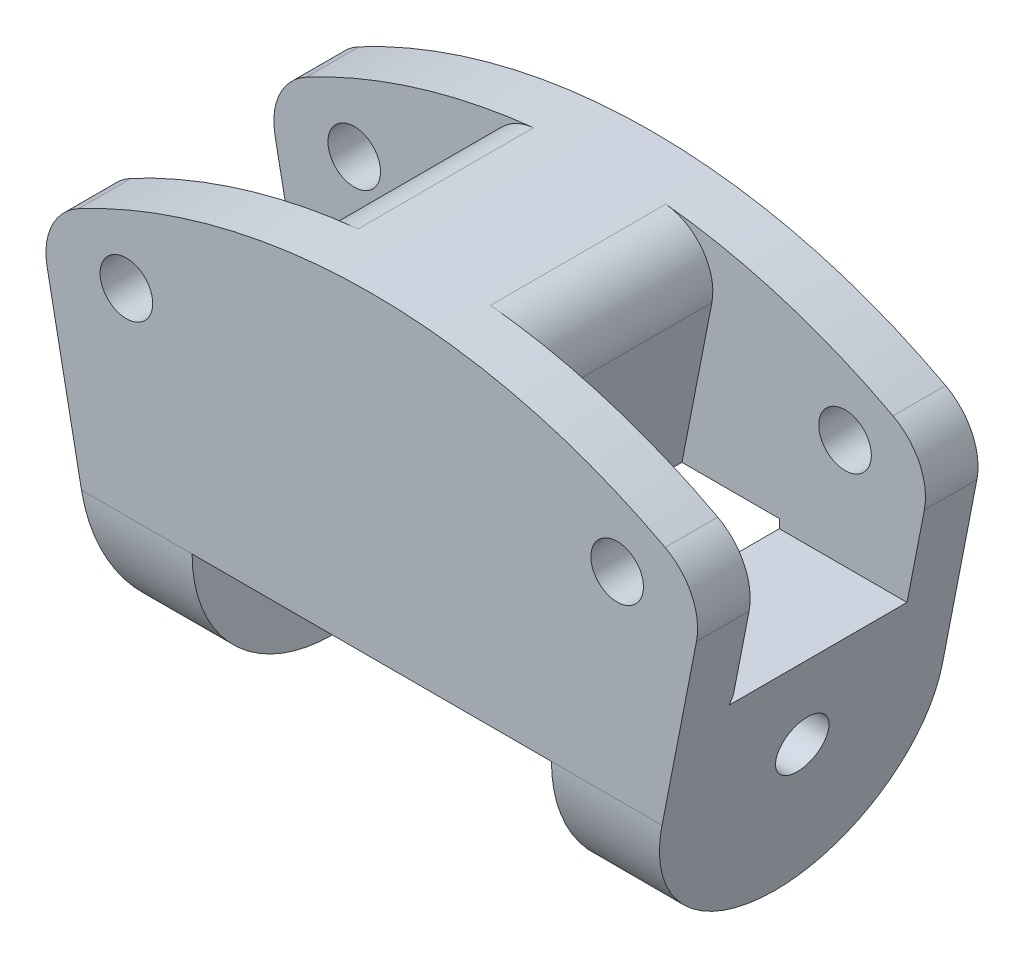
ISO-10303-21;
HEADER;
FILE_DESCRIPTION(('STEP AP214'),'2;1');
FILE_NAME('part.step','',(''),(''),'','','');
FILE_SCHEMA(('AUTOMOTIVE_DESIGN { 1 0 10303 214 1 1 1 1 }'));
ENDSEC;
DATA;
#1=APPLICATION_CONTEXT('core data for automotive mechanical design processes');
#2=APPLICATION_PROTOCOL_DEFINITION('international standard','automotive_design',2000,#1);
#3=PRODUCT_CONTEXT('',#1,'mechanical');
#4=PRODUCT('Part','Part','',(#3));
#5=PRODUCT_RELATED_PRODUCT_CATEGORY('part','',(#4));
#6=PRODUCT_DEFINITION_FORMATION('','',#4);
#7=PRODUCT_DEFINITION_CONTEXT('part definition',#1,'design');
#8=PRODUCT_DEFINITION('design','',#6,#7);
#9=PRODUCT_DEFINITION_SHAPE('','',#8);
#10=(LENGTH_UNIT() NAMED_UNIT(*) SI_UNIT(.MILLI.,.METRE.));
#11=(NAMED_UNIT(*) PLANE_ANGLE_UNIT() SI_UNIT($,.RADIAN.));
#12=(NAMED_UNIT(*) SI_UNIT($,.STERADIAN.) SOLID_ANGLE_UNIT());
#13=UNCERTAINTY_MEASURE_WITH_UNIT(LENGTH_MEASURE(1.E-05),#10,'distance_accuracy_value','');
#14=(GEOMETRIC_REPRESENTATION_CONTEXT(3) GLOBAL_UNCERTAINTY_ASSIGNED_CONTEXT((#13)) GLOBAL_UNIT_ASSIGNED_CONTEXT((#10,
#11,#12)) REPRESENTATION_CONTEXT('',''));
#15=CARTESIAN_POINT('',(0.,0.,0.));
#16=DIRECTION('',(0.,0.,1.));
#17=DIRECTION('',(1.,0.,0.));
#18=AXIS2_PLACEMENT_3D('',#15,#16,#17);
#19=CARTESIAN_POINT('',(0.,-9.5681818181819,5.));
#20=DIRECTION('',(0.,0.,1.));
#21=DIRECTION('',(1.,0.,0.));
#22=AXIS2_PLACEMENT_3D('',#19,#20,#21);
#23=PLANE('',#22);
#24=CARTESIAN_POINT('',(14.,19.25,5.));
#25=DIRECTION('',(0.,0.,1.));
#26=DIRECTION('',(1.,0.,0.));
#27=AXIS2_PLACEMENT_3D('',#24,#25,#26);
#28=CIRCLE('',#27,1.5);
#29=CARTESIAN_POINT('',(15.5,19.25,5.));
#30=VERTEX_POINT('',#29);
#31=EDGE_CURVE('E335',#30,#30,#28,.T.);
#32=ORIENTED_EDGE('',*,*,#31,.T.);
#33=EDGE_LOOP('',(#32));
#34=FACE_BOUND('',#33,.T.);
#35=DIRECTION('',(0.191510359419648,0.981490592025699,0.));
#36=VECTOR('',#35,1.);
#37=CARTESIAN_POINT('',(17.5365853658537,13.,5.));
#38=LINE('',#37,#36);
#39=CARTESIAN_POINT('',(17.6341463414634,13.5,5.));
#40=VERTEX_POINT('',#39);
#41=CARTESIAN_POINT('',(18.5235794301681,18.0583445796115,5.));
#42=VERTEX_POINT('',#41);
#43=EDGE_CURVE('E325',#40,#42,#38,.T.);
#44=ORIENTED_EDGE('',*,*,#43,.F.);
#45=DIRECTION('',(-1.,0.,0.));
#46=VECTOR('',#45,1.);
#47=CARTESIAN_POINT('',(0.,13.5000000000001,5.));
#48=LINE('',#47,#46);
#49=CARTESIAN_POINT('',(4.69670636919273,13.5,5.));
#50=VERTEX_POINT('',#49);
#51=EDGE_CURVE('E437',#40,#50,#48,.T.);
#52=ORIENTED_EDGE('',*,*,#51,.T.);
#53=DIRECTION('',(-0.191510359419649,-0.981490592025699,0.));
#54=VECTOR('',#53,1.);
#55=CARTESIAN_POINT('',(7.,25.3043798578872,5.));
#56=LINE('',#55,#54);
#57=CARTESIAN_POINT('',(6.40234187848178,22.2413819851063,5.));
#58=VERTEX_POINT('',#57);
#59=EDGE_CURVE('E316',#58,#50,#56,.T.);
#60=ORIENTED_EDGE('',*,*,#59,.F.);
#61=CARTESIAN_POINT('',(3.45787010240468,22.8159130633653,5.));
#62=DIRECTION('',(0.,0.,1.));
#63=DIRECTION('',(1.,0.,0.));
#64=AXIS2_PLACEMENT_3D('',#61,#62,#63);
#65=CIRCLE('',#64,3.);
#66=CARTESIAN_POINT('',(3.77638988852988,25.7989559973249,5.));
#67=VERTEX_POINT('',#66);
#68=EDGE_CURVE('E44',#58,#67,#65,.T.);
#69=ORIENTED_EDGE('',*,*,#68,.T.);
#70=CARTESIAN_POINT('',(0.,-9.5681818181819,5.));
#71=DIRECTION('',(0.,0.,1.));
#72=DIRECTION('',(1.,0.,0.));
#73=AXIS2_PLACEMENT_3D('',#70,#71,#72);
#74=CIRCLE('',#73,35.5681818181819);
#75=CARTESIAN_POINT('',(16.7351432249414,21.8170143591872,5.));
#76=VERTEX_POINT('',#75);
#77=EDGE_CURVE('E331',#76,#67,#74,.T.);
#78=ORIENTED_EDGE('',*,*,#77,.F.);
#79=CARTESIAN_POINT('',(15.0883623580782,18.7286308375803,5.));
#80=DIRECTION('',(0.,0.,1.));
#81=DIRECTION('',(1.,0.,0.));
#82=AXIS2_PLACEMENT_3D('',#79,#80,#81);
#83=CIRCLE('',#82,3.5);
#84=EDGE_CURVE('E327',#42,#76,#83,.T.);
#85=ORIENTED_EDGE('',*,*,#84,.F.);
#86=EDGE_LOOP('',(#44,#52,#60,#69,#78,#85));
#87=FACE_BOUND('',#86,.T.);
#88=ADVANCED_FACE('F36',(#34,#87),#23,.F.);
#89=CARTESIAN_POINT('',(-15.0883623580782,18.7286308375803,8.));
#90=DIRECTION('',(0.,0.,-1.));
#91=DIRECTION('',(-1.,0.,0.));
#92=AXIS2_PLACEMENT_3D('',#89,#90,#91);
#93=CYLINDRICAL_SURFACE('',#92,3.5);
#94=CARTESIAN_POINT('',(-15.0883623580782,18.7286308375803,5.));
#95=DIRECTION('',(0.,0.,1.));
#96=DIRECTION('',(-1.,0.,0.));
#97=AXIS2_PLACEMENT_3D('',#94,#95,#96);
#98=CIRCLE('',#97,3.5);
#99=CARTESIAN_POINT('',(-16.7351432249414,21.8170143591872,5.));
#100=VERTEX_POINT('',#99);
#101=CARTESIAN_POINT('',(-18.5235794301681,18.0583445796115,5.));
#102=VERTEX_POINT('',#101);
#103=EDGE_CURVE('E303',#100,#102,#98,.T.);
#104=ORIENTED_EDGE('',*,*,#103,.T.);
#105=DIRECTION('',(0.,0.,-1.));
#106=VECTOR('',#105,1.);
#107=CARTESIAN_POINT('',(-18.5235794301681,18.0583445796115,8.));
#108=LINE('',#107,#106);
#109=CARTESIAN_POINT('',(-18.5235794301681,18.0583445796115,8.));
#110=VERTEX_POINT('',#109);
#111=EDGE_CURVE('E390',#110,#102,#108,.T.);
#112=ORIENTED_EDGE('',*,*,#111,.F.);
#113=CARTESIAN_POINT('',(-15.0883623580782,18.7286308375803,8.));
#114=DIRECTION('',(0.,0.,1.));
#115=DIRECTION('',(1.,0.,0.));
#116=AXIS2_PLACEMENT_3D('',#113,#114,#115);
#117=CIRCLE('',#116,3.5);
#118=CARTESIAN_POINT('',(-16.7351432249414,21.8170143591872,8.));
#119=VERTEX_POINT('',#118);
#120=EDGE_CURVE('E374',#119,#110,#117,.T.);
#121=ORIENTED_EDGE('',*,*,#120,.F.);
#122=DIRECTION('',(0.,0.,-1.));
#123=VECTOR('',#122,1.);
#124=CARTESIAN_POINT('',(-16.7351432249414,21.8170143591872,8.));
#125=LINE('',#124,#123);
#126=EDGE_CURVE('E394',#119,#100,#125,.T.);
#127=ORIENTED_EDGE('',*,*,#126,.T.);
#128=EDGE_LOOP('',(#104,#112,#121,#127));
#129=FACE_BOUND('',#128,.T.);
#130=ADVANCED_FACE('F583',(#129),#93,.T.);
#131=CARTESIAN_POINT('',(-14.,19.25,8.));
#132=DIRECTION('',(0.,0.,-1.));
#133=DIRECTION('',(-1.,0.,0.));
#134=AXIS2_PLACEMENT_3D('',#131,#132,#133);
#135=CYLINDRICAL_SURFACE('',#134,1.5);
#136=CARTESIAN_POINT('',(-14.,19.25,8.));
#137=DIRECTION('',(0.,0.,1.));
#138=DIRECTION('',(1.,0.,0.));
#139=AXIS2_PLACEMENT_3D('',#136,#137,#138);
#140=CIRCLE('',#139,1.5);
#141=CARTESIAN_POINT('',(-12.5,19.25,8.));
#142=VERTEX_POINT('',#141);
#143=EDGE_CURVE('E358',#142,#142,#140,.T.);
#144=ORIENTED_EDGE('',*,*,#143,.T.);
#145=EDGE_LOOP('',(#144));
#146=FACE_BOUND('',#145,.T.);
#147=CARTESIAN_POINT('',(-14.,19.25,5.));
#148=DIRECTION('',(0.,0.,-1.));
#149=DIRECTION('',(-1.,0.,0.));
#150=AXIS2_PLACEMENT_3D('',#147,#148,#149);
#151=CIRCLE('',#150,1.5);
#152=CARTESIAN_POINT('',(-15.5,19.25,5.));
#153=VERTEX_POINT('',#152);
#154=EDGE_CURVE('E312',#153,#153,#151,.T.);
#155=ORIENTED_EDGE('',*,*,#154,.T.);
#156=EDGE_LOOP('',(#155));
#157=FACE_BOUND('',#156,.T.);
#158=ADVANCED_FACE('F588',(#146,#157),#135,.F.);
#159=CARTESIAN_POINT('',(15.,0.,8.));
#160=DIRECTION('',(-0.981490592025699,0.191510359419649,0.));
#161=DIRECTION('',(-0.191510359419649,-0.981490592025699,0.));
#162=AXIS2_PLACEMENT_3D('',#159,#160,#161);
#163=PLANE('',#162);
#164=CARTESIAN_POINT('',(16.5609756097561,8.,0.));
#165=DIRECTION('',(-0.981490592025699,0.191510359419649,0.));
#166=DIRECTION('',(-0.191510359419649,-0.981490592025699,0.));
#167=AXIS2_PLACEMENT_3D('',#164,#165,#166);
#168=ELLIPSE('',#167,1.52828770055162,1.5);
#169=CARTESIAN_POINT('',(16.2682926829268,6.5,0.));
#170=VERTEX_POINT('',#169);
#171=EDGE_CURVE('E278',#170,#170,#168,.T.);
#172=ORIENTED_EDGE('',*,*,#171,.T.);
#173=EDGE_LOOP('',(#172));
#174=FACE_BOUND('',#173,.T.);
#175=DIRECTION('',(0.,0.,1.));
#176=VECTOR('',#175,1.);
#177=CARTESIAN_POINT('',(17.5365853658537,13.,-5.));
#178=LINE('',#177,#176);
#179=CARTESIAN_POINT('',(17.5365853658537,13.,-5.));
#180=VERTEX_POINT('',#179);
#181=CARTESIAN_POINT('',(17.5365853658537,13.,5.13636363636365));
#182=VERTEX_POINT('',#181);
#183=EDGE_CURVE('E324',#180,#182,#178,.T.);
#184=ORIENTED_EDGE('',*,*,#183,.T.);
#185=DIRECTION('',(-0.184997280841847,-0.948111064314465,0.258575744813033));
#186=VECTOR('',#185,1.);
#187=CARTESIAN_POINT('',(17.0306354243086,10.4070065495815,5.84354366829595));
#188=LINE('',#187,#186);
#189=EDGE_CURVE('E445',#182,#40,#188,.F.);
#190=ORIENTED_EDGE('',*,*,#189,.T.);
#191=ORIENTED_EDGE('',*,*,#43,.T.);
#192=DIRECTION('',(0.,0.,-1.));
#193=VECTOR('',#192,1.);
#194=CARTESIAN_POINT('',(18.5235794301681,18.0583445796115,8.));
#195=LINE('',#194,#193);
#196=CARTESIAN_POINT('',(18.5235794301681,18.0583445796115,8.));
#197=VERTEX_POINT('',#196);
#198=EDGE_CURVE('E402',#197,#42,#195,.T.);
#199=ORIENTED_EDGE('',*,*,#198,.F.);
#200=DIRECTION('',(0.191510359419649,0.981490592025699,0.));
#201=VECTOR('',#200,1.);
#202=CARTESIAN_POINT('',(15.,0.,8.));
#203=LINE('',#202,#201);
#204=CARTESIAN_POINT('',(16.5609756097561,8.,8.));
#205=VERTEX_POINT('',#204);
#206=EDGE_CURVE('E367',#205,#197,#203,.T.);
#207=ORIENTED_EDGE('',*,*,#206,.F.);
#208=CARTESIAN_POINT('',(16.5609756097561,8.,0.));
#209=DIRECTION('',(-0.981490592025699,0.191510359419649,0.));
#210=DIRECTION('',(-0.191510359419649,-0.981490592025699,0.));
#211=AXIS2_PLACEMENT_3D('',#208,#209,#210);
#212=ELLIPSE('',#211,8.15086773627529,8.);
#213=CARTESIAN_POINT('',(15.,0.,0.));
#214=VERTEX_POINT('',#213);
#215=EDGE_CURVE('E405',#205,#214,#212,.F.);
#216=ORIENTED_EDGE('',*,*,#215,.T.);
#217=CARTESIAN_POINT('',(16.5609756097561,8.,0.));
#218=DIRECTION('',(-0.981490592025699,0.191510359419649,0.));
#219=DIRECTION('',(0.191510359419649,0.981490592025699,0.));
#220=AXIS2_PLACEMENT_3D('',#217,#218,#219);
#221=ELLIPSE('',#220,8.15086773627529,8.);
#222=CARTESIAN_POINT('',(16.5609756097561,8.,-8.));
#223=VERTEX_POINT('',#222);
#224=EDGE_CURVE('E407',#214,#223,#221,.F.);
#225=ORIENTED_EDGE('',*,*,#224,.T.);
#226=DIRECTION('',(0.191510359419649,0.981490592025699,0.));
#227=VECTOR('',#226,1.);
#228=CARTESIAN_POINT('',(15.,0.,-8.));
#229=LINE('',#228,#227);
#230=CARTESIAN_POINT('',(18.5235794301681,18.0583445796115,-8.));
#231=VERTEX_POINT('',#230);
#232=EDGE_CURVE('E379',#223,#231,#229,.T.);
#233=ORIENTED_EDGE('',*,*,#232,.T.);
#234=CARTESIAN_POINT('',(18.5235794301681,18.0583445796115,-5.));
#235=VERTEX_POINT('',#234);
#236=EDGE_CURVE('E401',#235,#231,#195,.T.);
#237=ORIENTED_EDGE('',*,*,#236,.F.);
#238=DIRECTION('',(0.191510359419648,0.981490592025699,0.));
#239=VECTOR('',#238,1.);
#240=CARTESIAN_POINT('',(17.5365853658537,13.,-5.));
#241=LINE('',#240,#239);
#242=EDGE_CURVE('E315',#180,#235,#241,.T.);
#243=ORIENTED_EDGE('',*,*,#242,.F.);
#244=EDGE_LOOP('',(#184,#190,#191,#199,#207,#216,#225,#233,#237,#243));
#245=FACE_BOUND('',#244,.T.);
#246=ADVANCED_FACE('F540',(#174,#245),#163,.F.);
#247=CARTESIAN_POINT('',(15.0883623580782,18.7286308375803,8.));
#248=DIRECTION('',(0.,0.,-1.));
#249=DIRECTION('',(-1.,0.,0.));
#250=AXIS2_PLACEMENT_3D('',#247,#248,#249);
#251=CYLINDRICAL_SURFACE('',#250,3.5);
#252=CARTESIAN_POINT('',(15.0883623580782,18.7286308375803,-5.));
#253=DIRECTION('',(0.,0.,1.));
#254=DIRECTION('',(1.,0.,0.));
#255=AXIS2_PLACEMENT_3D('',#252,#253,#254);
#256=CIRCLE('',#255,3.5);
#257=CARTESIAN_POINT('',(16.7351432249414,21.8170143591872,-5.));
#258=VERTEX_POINT('',#257);
#259=EDGE_CURVE('E318',#235,#258,#256,.T.);
#260=ORIENTED_EDGE('',*,*,#259,.F.);
#261=ORIENTED_EDGE('',*,*,#236,.T.);
#262=CARTESIAN_POINT('',(15.0883623580782,18.7286308375803,-8.));
#263=DIRECTION('',(0.,0.,1.));
#264=DIRECTION('',(1.,0.,0.));
#265=AXIS2_PLACEMENT_3D('',#262,#263,#264);
#266=CIRCLE('',#265,3.5);
#267=CARTESIAN_POINT('',(16.7351432249414,21.8170143591872,-8.));
#268=VERTEX_POINT('',#267);
#269=EDGE_CURVE('E382',#231,#268,#266,.T.);
#270=ORIENTED_EDGE('',*,*,#269,.T.);
#271=DIRECTION('',(0.,0.,-1.));
#272=VECTOR('',#271,1.);
#273=CARTESIAN_POINT('',(16.7351432249414,21.8170143591872,8.));
#274=LINE('',#273,#272);
#275=EDGE_CURVE('E397',#258,#268,#274,.T.);
#276=ORIENTED_EDGE('',*,*,#275,.F.);
#277=EDGE_LOOP('',(#260,#261,#270,#276));
#278=FACE_BOUND('',#277,.T.);
#279=ADVANCED_FACE('F537',(#278),#251,.T.);
#280=CARTESIAN_POINT('',(0.,-9.5681818181819,8.));
#281=DIRECTION('',(0.,0.,-1.));
#282=DIRECTION('',(-1.,0.,0.));
#283=AXIS2_PLACEMENT_3D('',#280,#281,#282);
#284=CYLINDRICAL_SURFACE('',#283,35.5681818181819);
#285=DIRECTION('',(0.,0.,-1.));
#286=VECTOR('',#285,1.);
#287=CARTESIAN_POINT('',(-3.77638988852988,25.7989559973249,8.));
#288=LINE('',#287,#286);
#289=CARTESIAN_POINT('',(-3.77638988852988,25.7989559973249,-5.));
#290=VERTEX_POINT('',#289);
#291=CARTESIAN_POINT('',(-3.77638988852988,25.7989559973249,5.));
#292=VERTEX_POINT('',#291);
#293=EDGE_CURVE('E461',#290,#292,#288,.F.);
#294=ORIENTED_EDGE('',*,*,#293,.T.);
#295=CARTESIAN_POINT('',(0.,-9.5681818181819,5.));
#296=DIRECTION('',(0.,0.,1.));
#297=DIRECTION('',(-1.,0.,0.));
#298=AXIS2_PLACEMENT_3D('',#295,#296,#297);
#299=CIRCLE('',#298,35.5681818181819);
#300=EDGE_CURVE('E285',#292,#100,#299,.T.);
#301=ORIENTED_EDGE('',*,*,#300,.T.);
#302=ORIENTED_EDGE('',*,*,#126,.F.);
#303=CARTESIAN_POINT('',(0.,-9.5681818181819,8.));
#304=DIRECTION('',(0.,0.,1.));
#305=DIRECTION('',(1.,0.,0.));
#306=AXIS2_PLACEMENT_3D('',#303,#304,#305);
#307=CIRCLE('',#306,35.5681818181819);
#308=CARTESIAN_POINT('',(16.7351432249414,21.8170143591872,8.));
#309=VERTEX_POINT('',#308);
#310=EDGE_CURVE('E372',#309,#119,#307,.T.);
#311=ORIENTED_EDGE('',*,*,#310,.F.);
#312=EDGE_CURVE('E398',#309,#76,#274,.T.);
#313=ORIENTED_EDGE('',*,*,#312,.T.);
#314=ORIENTED_EDGE('',*,*,#77,.T.);
#315=DIRECTION('',(0.,0.,-1.));
#316=VECTOR('',#315,1.);
#317=CARTESIAN_POINT('',(3.77638988852988,25.7989559973249,8.));
#318=LINE('',#317,#316);
#319=CARTESIAN_POINT('',(3.77638988852988,25.7989559973249,-5.));
#320=VERTEX_POINT('',#319);
#321=EDGE_CURVE('E458',#67,#320,#318,.T.);
#322=ORIENTED_EDGE('',*,*,#321,.T.);
#323=CARTESIAN_POINT('',(0.,-9.5681818181819,-5.));
#324=DIRECTION('',(0.,0.,1.));
#325=DIRECTION('',(1.,0.,0.));
#326=AXIS2_PLACEMENT_3D('',#323,#324,#325);
#327=CIRCLE('',#326,35.5681818181819);
#328=EDGE_CURVE('E320',#258,#320,#327,.T.);
#329=ORIENTED_EDGE('',*,*,#328,.F.);
#330=ORIENTED_EDGE('',*,*,#275,.T.);
#331=CARTESIAN_POINT('',(0.,-9.5681818181819,-8.));
#332=DIRECTION('',(0.,0.,1.));
#333=DIRECTION('',(1.,0.,0.));
#334=AXIS2_PLACEMENT_3D('',#331,#332,#333);
#335=CIRCLE('',#334,35.5681818181819);
#336=CARTESIAN_POINT('',(-16.7351432249414,21.8170143591872,-8.));
#337=VERTEX_POINT('',#336);
#338=EDGE_CURVE('E385',#268,#337,#335,.T.);
#339=ORIENTED_EDGE('',*,*,#338,.T.);
#340=CARTESIAN_POINT('',(-16.7351432249414,21.8170143591872,-5.));
#341=VERTEX_POINT('',#340);
#342=EDGE_CURVE('E393',#341,#337,#125,.T.);
#343=ORIENTED_EDGE('',*,*,#342,.F.);
#344=CARTESIAN_POINT('',(0.,-9.5681818181819,-5.));
#345=DIRECTION('',(0.,0.,1.));
#346=DIRECTION('',(-1.,0.,0.));
#347=AXIS2_PLACEMENT_3D('',#344,#345,#346);
#348=CIRCLE('',#347,35.5681818181819);
#349=EDGE_CURVE('E286',#290,#341,#348,.T.);
#350=ORIENTED_EDGE('',*,*,#349,.F.);
#351=EDGE_LOOP('',(#294,#301,#302,#311,#313,#314,#322,#329,#330,#339,#343,#350));
#352=FACE_BOUND('',#351,.T.);
#353=ADVANCED_FACE('F478',(#352),#284,.T.);
#354=CARTESIAN_POINT('',(14.,19.25,8.));
#355=DIRECTION('',(0.,0.,-1.));
#356=DIRECTION('',(-1.,0.,0.));
#357=AXIS2_PLACEMENT_3D('',#354,#355,#356);
#358=CYLINDRICAL_SURFACE('',#357,1.5);
#359=CARTESIAN_POINT('',(14.,19.25,-8.));
#360=DIRECTION('',(0.,0.,1.));
#361=DIRECTION('',(-1.,0.,0.));
#362=AXIS2_PLACEMENT_3D('',#359,#360,#361);
#363=CIRCLE('',#362,1.5);
#364=CARTESIAN_POINT('',(12.5,19.25,-8.));
#365=VERTEX_POINT('',#364);
#366=EDGE_CURVE('E354',#365,#365,#363,.T.);
#367=ORIENTED_EDGE('',*,*,#366,.F.);
#368=EDGE_LOOP('',(#367));
#369=FACE_BOUND('',#368,.T.);
#370=CARTESIAN_POINT('',(14.,19.25,-5.));
#371=DIRECTION('',(0.,0.,1.));
#372=DIRECTION('',(1.,0.,0.));
#373=AXIS2_PLACEMENT_3D('',#370,#371,#372);
#374=CIRCLE('',#373,1.5);
#375=CARTESIAN_POINT('',(15.5,19.25,-5.));
#376=VERTEX_POINT('',#375);
#377=EDGE_CURVE('E341',#376,#376,#374,.T.);
#378=ORIENTED_EDGE('',*,*,#377,.T.);
#379=EDGE_LOOP('',(#378));
#380=FACE_BOUND('',#379,.T.);
#381=ADVANCED_FACE('F634',(#369,#380),#358,.F.);
#382=CARTESIAN_POINT('',(-15.0883623580782,8.,0.));
#383=DIRECTION('',(-1.,0.,0.));
#384=DIRECTION('',(0.,0.,1.));
#385=AXIS2_PLACEMENT_3D('',#382,#383,#384);
#386=CYLINDRICAL_SURFACE('',#385,8.);
#387=CARTESIAN_POINT('',(10.25,8.,0.));
#388=DIRECTION('',(1.,0.,0.));
#389=DIRECTION('',(0.,0.,-1.));
#390=AXIS2_PLACEMENT_3D('',#387,#388,#389);
#391=CIRCLE('',#390,8.);
#392=CARTESIAN_POINT('',(10.25,0.,0.));
#393=VERTEX_POINT('',#392);
#394=CARTESIAN_POINT('',(10.25,8.,8.));
#395=VERTEX_POINT('',#394);
#396=EDGE_CURVE('E346',#393,#395,#391,.F.);
#397=ORIENTED_EDGE('',*,*,#396,.F.);
#398=DIRECTION('',(1.,0.,0.));
#399=VECTOR('',#398,1.);
#400=CARTESIAN_POINT('',(-15.,0.,0.));
#401=LINE('',#400,#399);
#402=EDGE_CURVE('E357',#214,#393,#401,.F.);
#403=ORIENTED_EDGE('',*,*,#402,.F.);
#404=ORIENTED_EDGE('',*,*,#215,.F.);
#405=DIRECTION('',(1.,0.,0.));
#406=VECTOR('',#405,1.);
#407=CARTESIAN_POINT('',(15.,8.,8.));
#408=LINE('',#407,#406);
#409=EDGE_CURVE('E416',#395,#205,#408,.T.);
#410=ORIENTED_EDGE('',*,*,#409,.F.);
#411=EDGE_LOOP('',(#397,#403,#404,#410));
#412=FACE_BOUND('',#411,.T.);
#413=ADVANCED_FACE('F548',(#412),#386,.T.);
#414=CARTESIAN_POINT('',(15.,8.,0.));
#415=DIRECTION('',(1.,0.,0.));
#416=DIRECTION('',(0.,0.,-1.));
#417=AXIS2_PLACEMENT_3D('',#414,#415,#416);
#418=CYLINDRICAL_SURFACE('',#417,8.);
#419=CARTESIAN_POINT('',(10.25,8.,0.));
#420=DIRECTION('',(1.,0.,0.));
#421=DIRECTION('',(0.,0.,-1.));
#422=AXIS2_PLACEMENT_3D('',#419,#420,#421);
#423=CIRCLE('',#422,8.);
#424=CARTESIAN_POINT('',(10.25,8.,-8.));
#425=VERTEX_POINT('',#424);
#426=EDGE_CURVE('E425',#425,#393,#423,.F.);
#427=ORIENTED_EDGE('',*,*,#426,.F.);
#428=DIRECTION('',(1.,0.,0.));
#429=VECTOR('',#428,1.);
#430=CARTESIAN_POINT('',(-15.0883623580782,8.,-8.));
#431=LINE('',#430,#429);
#432=EDGE_CURVE('E247',#223,#425,#431,.F.);
#433=ORIENTED_EDGE('',*,*,#432,.F.);
#434=ORIENTED_EDGE('',*,*,#224,.F.);
#435=ORIENTED_EDGE('',*,*,#402,.T.);
#436=EDGE_LOOP('',(#427,#433,#434,#435));
#437=FACE_BOUND('',#436,.T.);
#438=ADVANCED_FACE('F543',(#437),#418,.T.);
#439=CARTESIAN_POINT('',(-15.0883623580782,18.7286308375803,8.));
#440=DIRECTION('',(0.,0.,1.));
#441=DIRECTION('',(1.,0.,0.));
#442=AXIS2_PLACEMENT_3D('',#439,#440,#441);
#443=PLANE('',#442);
#444=ORIENTED_EDGE('',*,*,#143,.F.);
#445=EDGE_LOOP('',(#444));
#446=FACE_BOUND('',#445,.T.);
#447=DIRECTION('',(0.191510359419649,-0.981490592025699,0.));
#448=VECTOR('',#447,1.);
#449=CARTESIAN_POINT('',(-15.,0.,8.));
#450=LINE('',#449,#448);
#451=CARTESIAN_POINT('',(-16.5609756097561,8.,8.));
#452=VERTEX_POINT('',#451);
#453=EDGE_CURVE('E364',#110,#452,#450,.T.);
#454=ORIENTED_EDGE('',*,*,#453,.T.);
#455=CARTESIAN_POINT('',(-10.25,7.99999999999999,8.));
#456=VERTEX_POINT('',#455);
#457=EDGE_CURVE('E417',#452,#456,#408,.T.);
#458=ORIENTED_EDGE('',*,*,#457,.T.);
#459=DIRECTION('',(-1.,0.,0.));
#460=VECTOR('',#459,1.);
#461=CARTESIAN_POINT('',(-15.0883623580782,7.99999999999999,8.));
#462=LINE('',#461,#460);
#463=EDGE_CURVE('E338',#395,#456,#462,.T.);
#464=ORIENTED_EDGE('',*,*,#463,.F.);
#465=ORIENTED_EDGE('',*,*,#409,.T.);
#466=ORIENTED_EDGE('',*,*,#206,.T.);
#467=CARTESIAN_POINT('',(15.0883623580782,18.7286308375803,8.));
#468=DIRECTION('',(0.,0.,1.));
#469=DIRECTION('',(1.,0.,0.));
#470=AXIS2_PLACEMENT_3D('',#467,#468,#469);
#471=CIRCLE('',#470,3.5);
#472=EDGE_CURVE('E370',#197,#309,#471,.T.);
#473=ORIENTED_EDGE('',*,*,#472,.T.);
#474=ORIENTED_EDGE('',*,*,#310,.T.);
#475=ORIENTED_EDGE('',*,*,#120,.T.);
#476=EDGE_LOOP('',(#454,#458,#464,#465,#466,#473,#474,#475));
#477=FACE_BOUND('',#476,.T.);
#478=CARTESIAN_POINT('',(14.,19.25,8.));
#479=DIRECTION('',(0.,0.,1.));
#480=DIRECTION('',(-1.,0.,0.));
#481=AXIS2_PLACEMENT_3D('',#478,#479,#480);
#482=CIRCLE('',#481,1.5);
#483=CARTESIAN_POINT('',(12.5,19.25,8.));
#484=VERTEX_POINT('',#483);
#485=EDGE_CURVE('E350',#484,#484,#482,.T.);
#486=ORIENTED_EDGE('',*,*,#485,.F.);
#487=EDGE_LOOP('',(#486));
#488=FACE_BOUND('',#487,.T.);
#489=ADVANCED_FACE('F553',(#446,#477,#488),#443,.T.);
#490=CARTESIAN_POINT('',(-15.0883623580782,18.7286308375803,-8.));
#491=DIRECTION('',(0.,0.,1.));
#492=DIRECTION('',(1.,0.,0.));
#493=AXIS2_PLACEMENT_3D('',#490,#491,#492);
#494=PLANE('',#493);
#495=CARTESIAN_POINT('',(-14.,19.25,-8.));
#496=DIRECTION('',(0.,0.,1.));
#497=DIRECTION('',(1.,0.,0.));
#498=AXIS2_PLACEMENT_3D('',#495,#496,#497);
#499=CIRCLE('',#498,1.5);
#500=CARTESIAN_POINT('',(-12.5,19.25,-8.));
#501=VERTEX_POINT('',#500);
#502=EDGE_CURVE('E353',#501,#501,#499,.T.);
#503=ORIENTED_EDGE('',*,*,#502,.T.);
#504=EDGE_LOOP('',(#503));
#505=FACE_BOUND('',#504,.T.);
#506=DIRECTION('',(1.,0.,0.));
#507=VECTOR('',#506,1.);
#508=CARTESIAN_POINT('',(10.25,13.5,-8.));
#509=LINE('',#508,#507);
#510=CARTESIAN_POINT('',(-10.25,13.5,-8.));
#511=VERTEX_POINT('',#510);
#512=CARTESIAN_POINT('',(10.25,13.5,-8.));
#513=VERTEX_POINT('',#512);
#514=EDGE_CURVE('E234',#511,#513,#509,.T.);
#515=ORIENTED_EDGE('',*,*,#514,.F.);
#516=DIRECTION('',(0.,1.,0.));
#517=VECTOR('',#516,1.);
#518=CARTESIAN_POINT('',(-10.25,13.5,-8.));
#519=LINE('',#518,#517);
#520=CARTESIAN_POINT('',(-10.25,8.,-8.));
#521=VERTEX_POINT('',#520);
#522=EDGE_CURVE('E240',#521,#511,#519,.T.);
#523=ORIENTED_EDGE('',*,*,#522,.F.);
#524=CARTESIAN_POINT('',(-16.5609756097561,8.,-8.));
#525=VERTEX_POINT('',#524);
#526=EDGE_CURVE('E409',#521,#525,#431,.F.);
#527=ORIENTED_EDGE('',*,*,#526,.T.);
#528=DIRECTION('',(0.191510359419649,-0.981490592025699,0.));
#529=VECTOR('',#528,1.);
#530=CARTESIAN_POINT('',(-15.,0.,-8.));
#531=LINE('',#530,#529);
#532=CARTESIAN_POINT('',(-18.5235794301681,18.0583445796115,-8.));
#533=VERTEX_POINT('',#532);
#534=EDGE_CURVE('E361',#533,#525,#531,.T.);
#535=ORIENTED_EDGE('',*,*,#534,.F.);
#536=CARTESIAN_POINT('',(-15.0883623580782,18.7286308375803,-8.));
#537=DIRECTION('',(0.,0.,1.));
#538=DIRECTION('',(1.,0.,0.));
#539=AXIS2_PLACEMENT_3D('',#536,#537,#538);
#540=CIRCLE('',#539,3.5);
#541=EDGE_CURVE('E368',#337,#533,#540,.T.);
#542=ORIENTED_EDGE('',*,*,#541,.F.);
#543=ORIENTED_EDGE('',*,*,#338,.F.);
#544=ORIENTED_EDGE('',*,*,#269,.F.);
#545=ORIENTED_EDGE('',*,*,#232,.F.);
#546=ORIENTED_EDGE('',*,*,#432,.T.);
#547=DIRECTION('',(0.,-1.,0.));
#548=VECTOR('',#547,1.);
#549=CARTESIAN_POINT('',(10.25,8.,-8.));
#550=LINE('',#549,#548);
#551=EDGE_CURVE('E224',#513,#425,#550,.T.);
#552=ORIENTED_EDGE('',*,*,#551,.F.);
#553=EDGE_LOOP('',(#515,#523,#527,#535,#542,#543,#544,#545,#546,#552));
#554=FACE_BOUND('',#553,.T.);
#555=ORIENTED_EDGE('',*,*,#366,.T.);
#556=EDGE_LOOP('',(#555));
#557=FACE_BOUND('',#556,.T.);
#558=ADVANCED_FACE('F243',(#505,#554,#557),#494,.F.);
#559=CARTESIAN_POINT('',(-15.,0.,8.));
#560=DIRECTION('',(0.981490592025699,0.191510359419649,0.));
#561=DIRECTION('',(-0.191510359419649,0.981490592025699,0.));
#562=AXIS2_PLACEMENT_3D('',#559,#560,#561);
#563=PLANE('',#562);
#564=CARTESIAN_POINT('',(-16.5609756097561,8.,0.));
#565=DIRECTION('',(0.981490592025699,0.191510359419649,0.));
#566=DIRECTION('',(-0.191510359419649,0.981490592025699,0.));
#567=AXIS2_PLACEMENT_3D('',#564,#565,#566);
#568=ELLIPSE('',#567,1.52828770055162,1.5);
#569=CARTESIAN_POINT('',(-16.8536585365854,9.5,0.));
#570=VERTEX_POINT('',#569);
#571=EDGE_CURVE('E275',#570,#570,#568,.T.);
#572=ORIENTED_EDGE('',*,*,#571,.T.);
#573=EDGE_LOOP('',(#572));
#574=FACE_BOUND('',#573,.T.);
#575=DIRECTION('',(-0.184997280841847,0.948111064314465,-0.258575744813033));
#576=VECTOR('',#575,1.);
#577=CARTESIAN_POINT('',(-17.0306354243086,10.4070065495815,5.84354366829595));
#578=LINE('',#577,#576);
#579=CARTESIAN_POINT('',(-17.6341463414634,13.5,5.));
#580=VERTEX_POINT('',#579);
#581=CARTESIAN_POINT('',(-17.5365853658537,13.,5.13636363636365));
#582=VERTEX_POINT('',#581);
#583=EDGE_CURVE('E440',#580,#582,#578,.F.);
#584=ORIENTED_EDGE('',*,*,#583,.T.);
#585=DIRECTION('',(0.,0.,1.));
#586=VECTOR('',#585,1.);
#587=CARTESIAN_POINT('',(-17.5365853658537,13.,-5.));
#588=LINE('',#587,#586);
#589=CARTESIAN_POINT('',(-17.5365853658537,13.,-5.));
#590=VERTEX_POINT('',#589);
#591=EDGE_CURVE('E300',#590,#582,#588,.T.);
#592=ORIENTED_EDGE('',*,*,#591,.F.);
#593=DIRECTION('',(0.191510359419648,-0.981490592025699,0.));
#594=VECTOR('',#593,1.);
#595=CARTESIAN_POINT('',(-17.5365853658537,13.,-5.));
#596=LINE('',#595,#594);
#597=CARTESIAN_POINT('',(-18.5235794301681,18.0583445796115,-5.));
#598=VERTEX_POINT('',#597);
#599=EDGE_CURVE('E291',#598,#590,#596,.T.);
#600=ORIENTED_EDGE('',*,*,#599,.F.);
#601=EDGE_CURVE('E376',#598,#533,#108,.T.);
#602=ORIENTED_EDGE('',*,*,#601,.T.);
#603=ORIENTED_EDGE('',*,*,#534,.T.);
#604=CARTESIAN_POINT('',(-16.5609756097561,8.,0.));
#605=DIRECTION('',(0.981490592025699,0.191510359419649,0.));
#606=DIRECTION('',(0.191510359419649,-0.981490592025699,0.));
#607=AXIS2_PLACEMENT_3D('',#604,#605,#606);
#608=ELLIPSE('',#607,8.15086773627529,8.);
#609=CARTESIAN_POINT('',(-15.,0.,0.));
#610=VERTEX_POINT('',#609);
#611=EDGE_CURVE('E413',#525,#610,#608,.F.);
#612=ORIENTED_EDGE('',*,*,#611,.T.);
#613=CARTESIAN_POINT('',(-16.5609756097561,8.,0.));
#614=DIRECTION('',(0.981490592025699,0.191510359419649,0.));
#615=DIRECTION('',(-0.191510359419649,0.981490592025699,0.));
#616=AXIS2_PLACEMENT_3D('',#613,#614,#615);
#617=ELLIPSE('',#616,8.15086773627529,8.);
#618=EDGE_CURVE('E411',#610,#452,#617,.F.);
#619=ORIENTED_EDGE('',*,*,#618,.T.);
#620=ORIENTED_EDGE('',*,*,#453,.F.);
#621=ORIENTED_EDGE('',*,*,#111,.T.);
#622=DIRECTION('',(0.191510359419648,-0.981490592025699,0.));
#623=VECTOR('',#622,1.);
#624=CARTESIAN_POINT('',(-17.5365853658537,13.,5.));
#625=LINE('',#624,#623);
#626=EDGE_CURVE('E306',#102,#580,#625,.T.);
#627=ORIENTED_EDGE('',*,*,#626,.T.);
#628=EDGE_LOOP('',(#584,#592,#600,#602,#603,#612,#619,#620,#621,#627));
#629=FACE_BOUND('',#628,.T.);
#630=ADVANCED_FACE('F527',(#574,#629),#563,.F.);
#631=ORIENTED_EDGE('',*,*,#198,.T.);
#632=ORIENTED_EDGE('',*,*,#84,.T.);
#633=ORIENTED_EDGE('',*,*,#312,.F.);
#634=ORIENTED_EDGE('',*,*,#472,.F.);
#635=EDGE_LOOP('',(#631,#632,#633,#634));
#636=FACE_BOUND('',#635,.T.);
#637=ADVANCED_FACE('F485',(#636),#251,.T.);
#638=ORIENTED_EDGE('',*,*,#601,.F.);
#639=CARTESIAN_POINT('',(-15.0883623580782,18.7286308375803,-5.));
#640=DIRECTION('',(0.,0.,1.));
#641=DIRECTION('',(-1.,0.,0.));
#642=AXIS2_PLACEMENT_3D('',#639,#640,#641);
#643=CIRCLE('',#642,3.5);
#644=EDGE_CURVE('E288',#341,#598,#643,.T.);
#645=ORIENTED_EDGE('',*,*,#644,.F.);
#646=ORIENTED_EDGE('',*,*,#342,.T.);
#647=ORIENTED_EDGE('',*,*,#541,.T.);
#648=EDGE_LOOP('',(#638,#645,#646,#647));
#649=FACE_BOUND('',#648,.T.);
#650=ADVANCED_FACE('F532',(#649),#93,.T.);
#651=CARTESIAN_POINT('',(-14.,19.25,-5.));
#652=DIRECTION('',(0.,0.,-1.));
#653=DIRECTION('',(-1.,0.,0.));
#654=AXIS2_PLACEMENT_3D('',#651,#652,#653);
#655=CIRCLE('',#654,1.5);
#656=CARTESIAN_POINT('',(-15.5,19.25,-5.));
#657=VERTEX_POINT('',#656);
#658=EDGE_CURVE('E328',#657,#657,#655,.T.);
#659=ORIENTED_EDGE('',*,*,#658,.F.);
#660=EDGE_LOOP('',(#659));
#661=FACE_BOUND('',#660,.T.);
#662=ORIENTED_EDGE('',*,*,#502,.F.);
#663=EDGE_LOOP('',(#662));
#664=FACE_BOUND('',#663,.T.);
#665=ADVANCED_FACE('F637',(#661,#664),#135,.F.);
#666=ORIENTED_EDGE('',*,*,#31,.F.);
#667=EDGE_LOOP('',(#666));
#668=FACE_BOUND('',#667,.T.);
#669=ORIENTED_EDGE('',*,*,#485,.T.);
#670=EDGE_LOOP('',(#669));
#671=FACE_BOUND('',#670,.T.);
#672=ADVANCED_FACE('F622',(#668,#671),#358,.F.);
#673=CARTESIAN_POINT('',(-10.25,8.,0.));
#674=DIRECTION('',(-1.,0.,0.));
#675=DIRECTION('',(0.,-1.,0.));
#676=AXIS2_PLACEMENT_3D('',#673,#674,#675);
#677=CIRCLE('',#676,8.);
#678=CARTESIAN_POINT('',(-10.25,0.,0.));
#679=VERTEX_POINT('',#678);
#680=EDGE_CURVE('E344',#456,#679,#677,.F.);
#681=ORIENTED_EDGE('',*,*,#680,.F.);
#682=ORIENTED_EDGE('',*,*,#457,.F.);
#683=ORIENTED_EDGE('',*,*,#618,.F.);
#684=EDGE_CURVE('E349',#679,#610,#401,.F.);
#685=ORIENTED_EDGE('',*,*,#684,.F.);
#686=EDGE_LOOP('',(#681,#682,#683,#685));
#687=FACE_BOUND('',#686,.T.);
#688=ADVANCED_FACE('F562',(#687),#386,.T.);
#689=CARTESIAN_POINT('',(-10.25,8.,0.));
#690=DIRECTION('',(-1.,0.,0.));
#691=DIRECTION('',(0.,-1.,0.));
#692=AXIS2_PLACEMENT_3D('',#689,#690,#691);
#693=CIRCLE('',#692,8.);
#694=EDGE_CURVE('E420',#679,#521,#693,.F.);
#695=ORIENTED_EDGE('',*,*,#694,.F.);
#696=ORIENTED_EDGE('',*,*,#684,.T.);
#697=ORIENTED_EDGE('',*,*,#611,.F.);
#698=ORIENTED_EDGE('',*,*,#526,.F.);
#699=EDGE_LOOP('',(#695,#696,#697,#698));
#700=FACE_BOUND('',#699,.T.);
#701=ADVANCED_FACE('F523',(#700),#418,.T.);
#702=CARTESIAN_POINT('',(10.25,-0.937448887678559,-10.));
#703=DIRECTION('',(1.,0.,0.));
#704=DIRECTION('',(0.,0.,-1.));
#705=AXIS2_PLACEMENT_3D('',#702,#703,#704);
#706=PLANE('',#705);
#707=CARTESIAN_POINT('',(10.25,8.,0.));
#708=DIRECTION('',(1.,0.,0.));
#709=DIRECTION('',(0.,0.,-1.));
#710=AXIS2_PLACEMENT_3D('',#707,#708,#709);
#711=CIRCLE('',#710,1.5);
#712=CARTESIAN_POINT('',(10.25,8.,-1.5));
#713=VERTEX_POINT('',#712);
#714=EDGE_CURVE('E272',#713,#713,#711,.T.);
#715=ORIENTED_EDGE('',*,*,#714,.T.);
#716=EDGE_LOOP('',(#715));
#717=FACE_BOUND('',#716,.T.);
#718=DIRECTION('',(0.,0.,1.));
#719=VECTOR('',#718,1.);
#720=CARTESIAN_POINT('',(10.25,8.,-10.));
#721=LINE('',#720,#719);
#722=CARTESIAN_POINT('',(10.25,8.,6.5));
#723=VERTEX_POINT('',#722);
#724=EDGE_CURVE('E339',#723,#395,#721,.T.);
#725=ORIENTED_EDGE('',*,*,#724,.F.);
#726=DIRECTION('',(0.,-0.964763821237733,0.263117405792106));
#727=VECTOR('',#726,1.);
#728=CARTESIAN_POINT('',(10.25,3.86975911223759,7.6264293330261));
#729=LINE('',#728,#727);
#730=CARTESIAN_POINT('',(10.25,13.,5.13636363636365));
#731=VERTEX_POINT('',#730);
#732=EDGE_CURVE('E452',#723,#731,#729,.F.);
#733=ORIENTED_EDGE('',*,*,#732,.T.);
#734=DIRECTION('',(0.,0.,-1.));
#735=VECTOR('',#734,1.);
#736=CARTESIAN_POINT('',(10.25,13.,-5.));
#737=LINE('',#736,#735);
#738=CARTESIAN_POINT('',(10.25,13.,-5.));
#739=VERTEX_POINT('',#738);
#740=EDGE_CURVE('E283',#731,#739,#737,.T.);
#741=ORIENTED_EDGE('',*,*,#740,.T.);
#742=DIRECTION('',(0.,1.,0.));
#743=VECTOR('',#742,1.);
#744=CARTESIAN_POINT('',(10.25,-9.5681818181819,-5.));
#745=LINE('',#744,#743);
#746=CARTESIAN_POINT('',(10.25,13.5,-5.));
#747=VERTEX_POINT('',#746);
#748=EDGE_CURVE('E227',#739,#747,#745,.T.);
#749=ORIENTED_EDGE('',*,*,#748,.T.);
#750=DIRECTION('',(0.,0.,-1.));
#751=VECTOR('',#750,1.);
#752=CARTESIAN_POINT('',(10.25,13.5,26.2249852767911));
#753=LINE('',#752,#751);
#754=EDGE_CURVE('E219',#747,#513,#753,.T.);
#755=ORIENTED_EDGE('',*,*,#754,.T.);
#756=ORIENTED_EDGE('',*,*,#551,.T.);
#757=ORIENTED_EDGE('',*,*,#426,.T.);
#758=ORIENTED_EDGE('',*,*,#396,.T.);
#759=EDGE_LOOP('',(#725,#733,#741,#749,#755,#756,#757,#758));
#760=FACE_BOUND('',#759,.T.);
#761=ADVANCED_FACE('F222',(#717,#760),#706,.F.);
#762=CARTESIAN_POINT('',(-10.25,-0.93744888767856,-10.));
#763=DIRECTION('',(-1.,0.,0.));
#764=DIRECTION('',(0.,-1.,0.));
#765=AXIS2_PLACEMENT_3D('',#762,#763,#764);
#766=PLANE('',#765);
#767=CARTESIAN_POINT('',(-10.25,8.,0.));
#768=DIRECTION('',(-1.,0.,0.));
#769=DIRECTION('',(0.,-1.,0.));
#770=AXIS2_PLACEMENT_3D('',#767,#768,#769);
#771=CIRCLE('',#770,1.5);
#772=CARTESIAN_POINT('',(-10.25,6.5,0.));
#773=VERTEX_POINT('',#772);
#774=EDGE_CURVE('E269',#773,#773,#771,.T.);
#775=ORIENTED_EDGE('',*,*,#774,.T.);
#776=EDGE_LOOP('',(#775));
#777=FACE_BOUND('',#776,.T.);
#778=ORIENTED_EDGE('',*,*,#694,.T.);
#779=ORIENTED_EDGE('',*,*,#522,.T.);
#780=DIRECTION('',(0.,0.,-1.));
#781=VECTOR('',#780,1.);
#782=CARTESIAN_POINT('',(-10.25,13.5,26.2249852767911));
#783=LINE('',#782,#781);
#784=CARTESIAN_POINT('',(-10.25,13.5,-5.));
#785=VERTEX_POINT('',#784);
#786=EDGE_CURVE('E237',#785,#511,#783,.T.);
#787=ORIENTED_EDGE('',*,*,#786,.F.);
#788=DIRECTION('',(0.,1.,0.));
#789=VECTOR('',#788,1.);
#790=CARTESIAN_POINT('',(-10.25,-9.5681818181819,-5.));
#791=LINE('',#790,#789);
#792=CARTESIAN_POINT('',(-10.25,13.,-5.));
#793=VERTEX_POINT('',#792);
#794=EDGE_CURVE('E255',#793,#785,#791,.T.);
#795=ORIENTED_EDGE('',*,*,#794,.F.);
#796=DIRECTION('',(0.,0.,1.));
#797=VECTOR('',#796,1.);
#798=CARTESIAN_POINT('',(-10.25,13.,-5.));
#799=LINE('',#798,#797);
#800=CARTESIAN_POINT('',(-10.25,13.,5.13636363636365));
#801=VERTEX_POINT('',#800);
#802=EDGE_CURVE('E281',#793,#801,#799,.T.);
#803=ORIENTED_EDGE('',*,*,#802,.T.);
#804=DIRECTION('',(0.,0.964763821237733,-0.263117405792106));
#805=VECTOR('',#804,1.);
#806=CARTESIAN_POINT('',(-10.25,3.86975911223759,7.62642933302609));
#807=LINE('',#806,#805);
#808=CARTESIAN_POINT('',(-10.25,7.99999999999999,6.5));
#809=VERTEX_POINT('',#808);
#810=EDGE_CURVE('E450',#801,#809,#807,.F.);
#811=ORIENTED_EDGE('',*,*,#810,.T.);
#812=DIRECTION('',(0.,0.,1.));
#813=VECTOR('',#812,1.);
#814=CARTESIAN_POINT('',(-10.25,7.99999999999999,-10.));
#815=LINE('',#814,#813);
#816=EDGE_CURVE('E336',#809,#456,#815,.T.);
#817=ORIENTED_EDGE('',*,*,#816,.T.);
#818=ORIENTED_EDGE('',*,*,#680,.T.);
#819=EDGE_LOOP('',(#778,#779,#787,#795,#803,#811,#817,#818));
#820=FACE_BOUND('',#819,.T.);
#821=ADVANCED_FACE('F515',(#777,#820),#766,.F.);
#822=CARTESIAN_POINT('',(10.25,8.,-10.));
#823=DIRECTION('',(0.,1.,0.));
#824=DIRECTION('',(-1.,0.,0.));
#825=AXIS2_PLACEMENT_3D('',#822,#823,#824);
#826=PLANE('',#825);
#827=ORIENTED_EDGE('',*,*,#816,.F.);
#828=DIRECTION('',(1.,0.,0.));
#829=VECTOR('',#828,1.);
#830=CARTESIAN_POINT('',(10.25,8.,6.5));
#831=LINE('',#830,#829);
#832=EDGE_CURVE('E443',#809,#723,#831,.T.);
#833=ORIENTED_EDGE('',*,*,#832,.T.);
#834=ORIENTED_EDGE('',*,*,#724,.T.);
#835=ORIENTED_EDGE('',*,*,#463,.T.);
#836=EDGE_LOOP('',(#827,#833,#834,#835));
#837=FACE_BOUND('',#836,.T.);
#838=ADVANCED_FACE('F559',(#837),#826,.F.);
#839=CARTESIAN_POINT('',(17.5365853658537,13.,-5.));
#840=DIRECTION('',(0.,-1.,0.));
#841=DIRECTION('',(0.,0.,-1.));
#842=AXIS2_PLACEMENT_3D('',#839,#840,#841);
#843=PLANE('',#842);
#844=DIRECTION('',(1.,0.,0.));
#845=VECTOR('',#844,1.);
#846=CARTESIAN_POINT('',(17.5365853658537,13.,-5.));
#847=LINE('',#846,#845);
#848=EDGE_CURVE('E313',#739,#180,#847,.T.);
#849=ORIENTED_EDGE('',*,*,#848,.F.);
#850=ORIENTED_EDGE('',*,*,#740,.F.);
#851=DIRECTION('',(-1.,0.,0.));
#852=VECTOR('',#851,1.);
#853=CARTESIAN_POINT('',(17.5365853658537,13.,5.13636363636365));
#854=LINE('',#853,#852);
#855=EDGE_CURVE('E455',#731,#182,#854,.F.);
#856=ORIENTED_EDGE('',*,*,#855,.T.);
#857=ORIENTED_EDGE('',*,*,#183,.F.);
#858=EDGE_LOOP('',(#849,#850,#856,#857));
#859=FACE_BOUND('',#858,.T.);
#860=ADVANCED_FACE('F568',(#859),#843,.F.);
#861=CARTESIAN_POINT('',(7.,25.3043798578872,-5.));
#862=DIRECTION('',(-0.981490592025699,0.191510359419649,0.));
#863=DIRECTION('',(-0.191510359419649,-0.981490592025699,0.));
#864=AXIS2_PLACEMENT_3D('',#861,#862,#863);
#865=PLANE('',#864);
#866=DIRECTION('',(-0.191510359419649,-0.981490592025699,0.));
#867=VECTOR('',#866,1.);
#868=CARTESIAN_POINT('',(7.,25.3043798578872,-5.));
#869=LINE('',#868,#867);
#870=CARTESIAN_POINT('',(6.40234187848178,22.2413819851063,-5.));
#871=VERTEX_POINT('',#870);
#872=CARTESIAN_POINT('',(4.69670636919273,13.5,-5.));
#873=VERTEX_POINT('',#872);
#874=EDGE_CURVE('E322',#871,#873,#869,.T.);
#875=ORIENTED_EDGE('',*,*,#874,.F.);
#876=DIRECTION('',(0.,0.,-1.));
#877=VECTOR('',#876,1.);
#878=CARTESIAN_POINT('',(6.40234187848178,22.2413819851063,-5.));
#879=LINE('',#878,#877);
#880=EDGE_CURVE('E466',#871,#58,#879,.F.);
#881=ORIENTED_EDGE('',*,*,#880,.T.);
#882=ORIENTED_EDGE('',*,*,#59,.T.);
#883=DIRECTION('',(0.,0.,-1.));
#884=VECTOR('',#883,1.);
#885=CARTESIAN_POINT('',(4.69670636919274,13.5,-5.));
#886=LINE('',#885,#884);
#887=EDGE_CURVE('E266',#50,#873,#886,.T.);
#888=ORIENTED_EDGE('',*,*,#887,.T.);
#889=EDGE_LOOP('',(#875,#881,#882,#888));
#890=FACE_BOUND('',#889,.T.);
#891=ADVANCED_FACE('F572',(#890),#865,.F.);
#892=CARTESIAN_POINT('',(0.,-9.5681818181819,-5.));
#893=DIRECTION('',(0.,0.,1.));
#894=DIRECTION('',(1.,0.,0.));
#895=AXIS2_PLACEMENT_3D('',#892,#893,#894);
#896=PLANE('',#895);
#897=DIRECTION('',(-1.,0.,0.));
#898=VECTOR('',#897,1.);
#899=CARTESIAN_POINT('',(0.,13.5,-5.));
#900=LINE('',#899,#898);
#901=EDGE_CURVE('E264',#747,#873,#900,.T.);
#902=ORIENTED_EDGE('',*,*,#901,.F.);
#903=ORIENTED_EDGE('',*,*,#748,.F.);
#904=ORIENTED_EDGE('',*,*,#848,.T.);
#905=ORIENTED_EDGE('',*,*,#242,.T.);
#906=ORIENTED_EDGE('',*,*,#259,.T.);
#907=ORIENTED_EDGE('',*,*,#328,.T.);
#908=CARTESIAN_POINT('',(3.45787010240468,22.8159130633653,-5.));
#909=DIRECTION('',(0.,0.,1.));
#910=DIRECTION('',(1.,0.,0.));
#911=AXIS2_PLACEMENT_3D('',#908,#909,#910);
#912=CIRCLE('',#911,3.);
#913=EDGE_CURVE('E11',#320,#871,#912,.F.);
#914=ORIENTED_EDGE('',*,*,#913,.T.);
#915=ORIENTED_EDGE('',*,*,#874,.T.);
#916=EDGE_LOOP('',(#902,#903,#904,#905,#906,#907,#914,#915));
#917=FACE_BOUND('',#916,.T.);
#918=ORIENTED_EDGE('',*,*,#377,.F.);
#919=EDGE_LOOP('',(#918));
#920=FACE_BOUND('',#919,.T.);
#921=ADVANCED_FACE('F569',(#917,#920),#896,.T.);
#922=DIRECTION('',(-0.191510359419649,0.981490592025699,0.));
#923=VECTOR('',#922,1.);
#924=CARTESIAN_POINT('',(-7.,25.3043798578872,5.));
#925=LINE('',#924,#923);
#926=CARTESIAN_POINT('',(-4.69670636919274,13.5,5.));
#927=VERTEX_POINT('',#926);
#928=CARTESIAN_POINT('',(-6.40234187848178,22.2413819851063,5.));
#929=VERTEX_POINT('',#928);
#930=EDGE_CURVE('E289',#927,#929,#925,.T.);
#931=ORIENTED_EDGE('',*,*,#930,.F.);
#932=DIRECTION('',(-1.,0.,0.));
#933=VECTOR('',#932,1.);
#934=CARTESIAN_POINT('',(0.,13.5000000000001,5.));
#935=LINE('',#934,#933);
#936=EDGE_CURVE('E427',#927,#580,#935,.T.);
#937=ORIENTED_EDGE('',*,*,#936,.T.);
#938=ORIENTED_EDGE('',*,*,#626,.F.);
#939=ORIENTED_EDGE('',*,*,#103,.F.);
#940=ORIENTED_EDGE('',*,*,#300,.F.);
#941=CARTESIAN_POINT('',(-3.45787010240468,22.8159130633653,5.));
#942=DIRECTION('',(0.,0.,1.));
#943=DIRECTION('',(1.,0.,0.));
#944=AXIS2_PLACEMENT_3D('',#941,#942,#943);
#945=CIRCLE('',#944,3.);
#946=EDGE_CURVE('E468',#292,#929,#945,.T.);
#947=ORIENTED_EDGE('',*,*,#946,.T.);
#948=EDGE_LOOP('',(#931,#937,#938,#939,#940,#947));
#949=FACE_BOUND('',#948,.T.);
#950=ORIENTED_EDGE('',*,*,#154,.F.);
#951=EDGE_LOOP('',(#950));
#952=FACE_BOUND('',#951,.T.);
#953=ADVANCED_FACE('F503',(#949,#952),#23,.F.);
#954=CARTESIAN_POINT('',(-7.,25.3043798578872,-5.));
#955=DIRECTION('',(0.981490592025699,0.191510359419649,0.));
#956=DIRECTION('',(-0.191510359419649,0.981490592025699,0.));
#957=AXIS2_PLACEMENT_3D('',#954,#955,#956);
#958=PLANE('',#957);
#959=ORIENTED_EDGE('',*,*,#930,.T.);
#960=DIRECTION('',(0.,0.,-1.));
#961=VECTOR('',#960,1.);
#962=CARTESIAN_POINT('',(-6.40234187848178,22.2413819851063,-5.));
#963=LINE('',#962,#961);
#964=CARTESIAN_POINT('',(-6.40234187848178,22.2413819851063,-5.));
#965=VERTEX_POINT('',#964);
#966=EDGE_CURVE('E464',#929,#965,#963,.T.);
#967=ORIENTED_EDGE('',*,*,#966,.T.);
#968=DIRECTION('',(-0.191510359419649,0.981490592025699,0.));
#969=VECTOR('',#968,1.);
#970=CARTESIAN_POINT('',(-7.,25.3043798578872,-5.));
#971=LINE('',#970,#969);
#972=CARTESIAN_POINT('',(-4.69670636919273,13.5,-5.));
#973=VERTEX_POINT('',#972);
#974=EDGE_CURVE('E297',#973,#965,#971,.T.);
#975=ORIENTED_EDGE('',*,*,#974,.F.);
#976=DIRECTION('',(0.,0.,1.));
#977=VECTOR('',#976,1.);
#978=CARTESIAN_POINT('',(-4.69670636919274,13.5,-5.));
#979=LINE('',#978,#977);
#980=EDGE_CURVE('E261',#973,#927,#979,.T.);
#981=ORIENTED_EDGE('',*,*,#980,.T.);
#982=EDGE_LOOP('',(#959,#967,#975,#981));
#983=FACE_BOUND('',#982,.T.);
#984=ADVANCED_FACE('F500',(#983),#958,.F.);
#985=CARTESIAN_POINT('',(-17.5365853658537,13.,-5.));
#986=DIRECTION('',(0.,-1.,0.));
#987=DIRECTION('',(0.,0.,-1.));
#988=AXIS2_PLACEMENT_3D('',#985,#986,#987);
#989=PLANE('',#988);
#990=ORIENTED_EDGE('',*,*,#591,.T.);
#991=DIRECTION('',(-1.,0.,0.));
#992=VECTOR('',#991,1.);
#993=CARTESIAN_POINT('',(-17.5365853658537,13.,5.13636363636365));
#994=LINE('',#993,#992);
#995=EDGE_CURVE('E447',#582,#801,#994,.F.);
#996=ORIENTED_EDGE('',*,*,#995,.T.);
#997=ORIENTED_EDGE('',*,*,#802,.F.);
#998=DIRECTION('',(1.,0.,0.));
#999=VECTOR('',#998,1.);
#1000=CARTESIAN_POINT('',(-17.5365853658537,13.,-5.));
#1001=LINE('',#1000,#999);
#1002=EDGE_CURVE('E294',#590,#793,#1001,.T.);
#1003=ORIENTED_EDGE('',*,*,#1002,.F.);
#1004=EDGE_LOOP('',(#990,#996,#997,#1003));
#1005=FACE_BOUND('',#1004,.T.);
#1006=ADVANCED_FACE('F595',(#1005),#989,.F.);
#1007=CARTESIAN_POINT('',(0.,-9.5681818181819,-5.));
#1008=DIRECTION('',(0.,0.,-1.));
#1009=DIRECTION('',(-1.,0.,0.));
#1010=AXIS2_PLACEMENT_3D('',#1007,#1008,#1009);
#1011=PLANE('',#1010);
#1012=ORIENTED_EDGE('',*,*,#658,.T.);
#1013=EDGE_LOOP('',(#1012));
#1014=FACE_BOUND('',#1013,.T.);
#1015=ORIENTED_EDGE('',*,*,#1002,.T.);
#1016=ORIENTED_EDGE('',*,*,#794,.T.);
#1017=DIRECTION('',(1.,0.,0.));
#1018=VECTOR('',#1017,1.);
#1019=CARTESIAN_POINT('',(0.,13.5,-5.));
#1020=LINE('',#1019,#1018);
#1021=EDGE_CURVE('E258',#785,#973,#1020,.T.);
#1022=ORIENTED_EDGE('',*,*,#1021,.T.);
#1023=ORIENTED_EDGE('',*,*,#974,.T.);
#1024=CARTESIAN_POINT('',(-3.45787010240468,22.8159130633653,-5.));
#1025=DIRECTION('',(0.,0.,-1.));
#1026=DIRECTION('',(-1.,0.,0.));
#1027=AXIS2_PLACEMENT_3D('',#1024,#1025,#1026);
#1028=CIRCLE('',#1027,3.);
#1029=EDGE_CURVE('E470',#965,#290,#1028,.T.);
#1030=ORIENTED_EDGE('',*,*,#1029,.T.);
#1031=ORIENTED_EDGE('',*,*,#349,.T.);
#1032=ORIENTED_EDGE('',*,*,#644,.T.);
#1033=ORIENTED_EDGE('',*,*,#599,.T.);
#1034=EDGE_LOOP('',(#1015,#1016,#1022,#1023,#1030,#1031,#1032,#1033));
#1035=FACE_BOUND('',#1034,.T.);
#1036=ADVANCED_FACE('F513',(#1014,#1035),#1011,.F.);
#1037=CARTESIAN_POINT('',(18.5883623580782,8.,0.));
#1038=DIRECTION('',(-1.,0.,0.));
#1039=DIRECTION('',(0.,0.,1.));
#1040=AXIS2_PLACEMENT_3D('',#1037,#1038,#1039);
#1041=CYLINDRICAL_SURFACE('',#1040,1.5);
#1042=ORIENTED_EDGE('',*,*,#774,.F.);
#1043=EDGE_LOOP('',(#1042));
#1044=FACE_BOUND('',#1043,.T.);
#1045=ORIENTED_EDGE('',*,*,#571,.F.);
#1046=EDGE_LOOP('',(#1045));
#1047=FACE_BOUND('',#1046,.T.);
#1048=ADVANCED_FACE('F605',(#1044,#1047),#1041,.F.);
#1049=ORIENTED_EDGE('',*,*,#714,.F.);
#1050=EDGE_LOOP('',(#1049));
#1051=FACE_BOUND('',#1050,.T.);
#1052=ORIENTED_EDGE('',*,*,#171,.F.);
#1053=EDGE_LOOP('',(#1052));
#1054=FACE_BOUND('',#1053,.T.);
#1055=ADVANCED_FACE('F607',(#1051,#1054),#1041,.F.);
#1056=CARTESIAN_POINT('',(10.25,13.5,26.2249852767911));
#1057=DIRECTION('',(0.,1.,0.));
#1058=DIRECTION('',(0.,0.,1.));
#1059=AXIS2_PLACEMENT_3D('',#1056,#1057,#1058);
#1060=PLANE('',#1059);
#1061=DIRECTION('',(1.,0.,0.));
#1062=VECTOR('',#1061,1.);
#1063=CARTESIAN_POINT('',(10.25,13.5,5.));
#1064=LINE('',#1063,#1062);
#1065=EDGE_CURVE('E231',#927,#50,#1064,.T.);
#1066=ORIENTED_EDGE('',*,*,#1065,.F.);
#1067=ORIENTED_EDGE('',*,*,#980,.F.);
#1068=ORIENTED_EDGE('',*,*,#1021,.F.);
#1069=ORIENTED_EDGE('',*,*,#786,.T.);
#1070=ORIENTED_EDGE('',*,*,#514,.T.);
#1071=ORIENTED_EDGE('',*,*,#754,.F.);
#1072=ORIENTED_EDGE('',*,*,#901,.T.);
#1073=ORIENTED_EDGE('',*,*,#887,.F.);
#1074=EDGE_LOOP('',(#1066,#1067,#1068,#1069,#1070,#1071,#1072,#1073));
#1075=FACE_BOUND('',#1074,.T.);
#1076=ADVANCED_FACE('F235',(#1075),#1060,.F.);
#1077=CARTESIAN_POINT('',(0.,13.5000000000001,5.));
#1078=DIRECTION('',(0.,0.263117405792106,0.964763821237733));
#1079=DIRECTION('',(0.,-0.964763821237733,0.263117405792106));
#1080=AXIS2_PLACEMENT_3D('',#1077,#1078,#1079);
#1081=PLANE('',#1080);
#1082=ORIENTED_EDGE('',*,*,#732,.F.);
#1083=ORIENTED_EDGE('',*,*,#832,.F.);
#1084=ORIENTED_EDGE('',*,*,#810,.F.);
#1085=ORIENTED_EDGE('',*,*,#995,.F.);
#1086=ORIENTED_EDGE('',*,*,#583,.F.);
#1087=ORIENTED_EDGE('',*,*,#936,.F.);
#1088=ORIENTED_EDGE('',*,*,#1065,.T.);
#1089=ORIENTED_EDGE('',*,*,#51,.F.);
#1090=ORIENTED_EDGE('',*,*,#189,.F.);
#1091=ORIENTED_EDGE('',*,*,#855,.F.);
#1092=EDGE_LOOP('',(#1082,#1083,#1084,#1085,#1086,#1087,#1088,#1089,#1090,#1091));
#1093=FACE_BOUND('',#1092,.T.);
#1094=ADVANCED_FACE('F493',(#1093),#1081,.F.);
#1095=CARTESIAN_POINT('',(-3.45787010240468,22.8159130633653,8.));
#1096=DIRECTION('',(0.,0.,-1.));
#1097=DIRECTION('',(-1.,0.,0.));
#1098=AXIS2_PLACEMENT_3D('',#1095,#1096,#1097);
#1099=CYLINDRICAL_SURFACE('',#1098,3.);
#1100=ORIENTED_EDGE('',*,*,#1029,.F.);
#1101=ORIENTED_EDGE('',*,*,#966,.F.);
#1102=ORIENTED_EDGE('',*,*,#946,.F.);
#1103=ORIENTED_EDGE('',*,*,#293,.F.);
#1104=EDGE_LOOP('',(#1100,#1101,#1102,#1103));
#1105=FACE_BOUND('',#1104,.T.);
#1106=ADVANCED_FACE('F509',(#1105),#1099,.T.);
#1107=CARTESIAN_POINT('',(3.45787010240468,22.8159130633653,8.));
#1108=DIRECTION('',(0.,0.,-1.));
#1109=DIRECTION('',(-1.,0.,0.));
#1110=AXIS2_PLACEMENT_3D('',#1107,#1108,#1109);
#1111=CYLINDRICAL_SURFACE('',#1110,3.);
#1112=ORIENTED_EDGE('',*,*,#913,.F.);
#1113=ORIENTED_EDGE('',*,*,#321,.F.);
#1114=ORIENTED_EDGE('',*,*,#68,.F.);
#1115=ORIENTED_EDGE('',*,*,#880,.F.);
#1116=EDGE_LOOP('',(#1112,#1113,#1114,#1115));
#1117=FACE_BOUND('',#1116,.T.);
#1118=ADVANCED_FACE('F38',(#1117),#1111,.T.);
#1119=CLOSED_SHELL('',(#88,#130,#158,#246,#279,#353,#381,#413,#438,#489,#558,#630,#637,#650,
#665,#672,#688,#701,#761,#821,#838,#860,#891,#921,#953,#984,#1006,#1036,#1048,#1055,#1076,#1094,
#1106,#1118));
#1120=MANIFOLD_SOLID_BREP('B2',#1119);
#1121=ADVANCED_BREP_SHAPE_REPRESENTATION('',(#18,#1120),#14);
#1122=SHAPE_DEFINITION_REPRESENTATION(#9,#1121);
ENDSEC;
END-ISO-10303-21;
